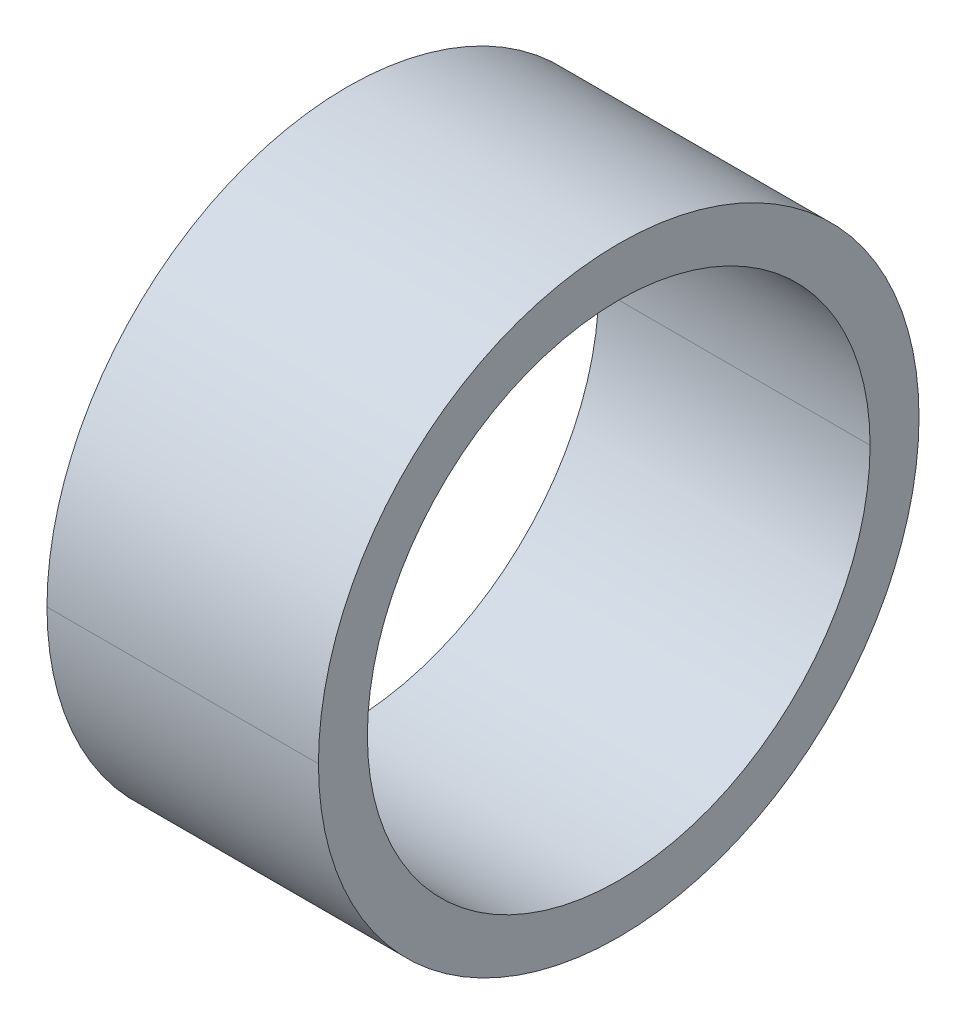
ISO-10303-21;
HEADER;
FILE_DESCRIPTION(('STEP AP214'),'2;1');
FILE_NAME('part.step','',(''),(''),'','','');
FILE_SCHEMA(('AUTOMOTIVE_DESIGN { 1 0 10303 214 1 1 1 1 }'));
ENDSEC;
DATA;
#1=APPLICATION_CONTEXT('core data for automotive mechanical design processes');
#2=APPLICATION_PROTOCOL_DEFINITION('international standard','automotive_design',2000,#1);
#3=PRODUCT_CONTEXT('',#1,'mechanical');
#4=PRODUCT('Part','Part','',(#3));
#5=PRODUCT_RELATED_PRODUCT_CATEGORY('part','',(#4));
#6=PRODUCT_DEFINITION_FORMATION('','',#4);
#7=PRODUCT_DEFINITION_CONTEXT('part definition',#1,'design');
#8=PRODUCT_DEFINITION('design','',#6,#7);
#9=PRODUCT_DEFINITION_SHAPE('','',#8);
#10=(LENGTH_UNIT() NAMED_UNIT(*) SI_UNIT(.MILLI.,.METRE.));
#11=(NAMED_UNIT(*) PLANE_ANGLE_UNIT() SI_UNIT($,.RADIAN.));
#12=(NAMED_UNIT(*) SI_UNIT($,.STERADIAN.) SOLID_ANGLE_UNIT());
#13=UNCERTAINTY_MEASURE_WITH_UNIT(LENGTH_MEASURE(1.E-05),#10,'distance_accuracy_value','');
#14=(GEOMETRIC_REPRESENTATION_CONTEXT(3) GLOBAL_UNCERTAINTY_ASSIGNED_CONTEXT((#13)) GLOBAL_UNIT_ASSIGNED_CONTEXT((#10,
#11,#12)) REPRESENTATION_CONTEXT('',''));
#15=CARTESIAN_POINT('',(0.,0.,0.));
#16=DIRECTION('',(0.,0.,1.));
#17=DIRECTION('',(1.,0.,0.));
#18=AXIS2_PLACEMENT_3D('',#15,#16,#17);
#19=CARTESIAN_POINT('',(-15.8,0.,0.));
#20=DIRECTION('',(1.,0.,0.));
#21=DIRECTION('',(0.,0.,-1.));
#22=AXIS2_PLACEMENT_3D('',#19,#20,#21);
#23=CYLINDRICAL_SURFACE('',#22,15.);
#24=DIRECTION('',(1.,0.,0.));
#25=VECTOR('',#24,1.);
#26=CARTESIAN_POINT('',(-15.8,0.,15.));
#27=LINE('',#26,#25);
#28=CARTESIAN_POINT('',(-15.8,0.,15.));
#29=VERTEX_POINT('',#28);
#30=CARTESIAN_POINT('',(0.399999999999999,0.,15.));
#31=VERTEX_POINT('',#30);
#32=EDGE_CURVE('E110',#29,#31,#27,.T.);
#33=ORIENTED_EDGE('',*,*,#32,.F.);
#34=CARTESIAN_POINT('',(-15.8,0.,0.));
#35=DIRECTION('',(1.,0.,0.));
#36=DIRECTION('',(0.,0.,-1.));
#37=AXIS2_PLACEMENT_3D('',#34,#35,#36);
#38=CIRCLE('',#37,15.);
#39=CARTESIAN_POINT('',(-15.8,0.,-15.));
#40=VERTEX_POINT('',#39);
#41=EDGE_CURVE('E28',#40,#29,#38,.T.);
#42=ORIENTED_EDGE('',*,*,#41,.F.);
#43=DIRECTION('',(1.,0.,0.));
#44=VECTOR('',#43,1.);
#45=CARTESIAN_POINT('',(-15.8,0.,-15.));
#46=LINE('',#45,#44);
#47=CARTESIAN_POINT('',(0.399999999999999,0.,-15.));
#48=VERTEX_POINT('',#47);
#49=EDGE_CURVE('E97',#40,#48,#46,.T.);
#50=ORIENTED_EDGE('',*,*,#49,.T.);
#51=CARTESIAN_POINT('',(0.399999999999999,0.,0.));
#52=DIRECTION('',(1.,0.,0.));
#53=DIRECTION('',(0.,0.,-1.));
#54=AXIS2_PLACEMENT_3D('',#51,#52,#53);
#55=CIRCLE('',#54,15.);
#56=EDGE_CURVE('E11',#48,#31,#55,.T.);
#57=ORIENTED_EDGE('',*,*,#56,.T.);
#58=EDGE_LOOP('',(#33,#42,#50,#57));
#59=FACE_BOUND('',#58,.T.);
#60=ADVANCED_FACE('F17',(#59),#23,.F.);
#61=CARTESIAN_POINT('',(0.399999999999999,0.,0.));
#62=DIRECTION('',(1.,0.,0.));
#63=DIRECTION('',(0.,1.,0.));
#64=AXIS2_PLACEMENT_3D('',#61,#62,#63);
#65=PLANE('',#64);
#66=ORIENTED_EDGE('',*,*,#56,.F.);
#67=CARTESIAN_POINT('',(0.399999999999999,0.,0.));
#68=DIRECTION('',(1.,0.,0.));
#69=DIRECTION('',(0.,0.,-1.));
#70=AXIS2_PLACEMENT_3D('',#67,#68,#69);
#71=CIRCLE('',#70,15.);
#72=EDGE_CURVE('E103',#31,#48,#71,.T.);
#73=ORIENTED_EDGE('',*,*,#72,.F.);
#74=EDGE_LOOP('',(#66,#73));
#75=FACE_BOUND('',#74,.T.);
#76=CARTESIAN_POINT('',(0.399999999999999,0.,0.));
#77=DIRECTION('',(1.,0.,0.));
#78=DIRECTION('',(0.,0.,-1.));
#79=AXIS2_PLACEMENT_3D('',#76,#77,#78);
#80=CIRCLE('',#79,17.92);
#81=CARTESIAN_POINT('',(0.399999999999999,0.,-17.92));
#82=VERTEX_POINT('',#81);
#83=CARTESIAN_POINT('',(0.399999999999999,0.,17.92));
#84=VERTEX_POINT('',#83);
#85=EDGE_CURVE('E93',#82,#84,#80,.T.);
#86=ORIENTED_EDGE('',*,*,#85,.T.);
#87=CARTESIAN_POINT('',(0.399999999999999,0.,0.));
#88=DIRECTION('',(1.,0.,0.));
#89=DIRECTION('',(0.,0.,-1.));
#90=AXIS2_PLACEMENT_3D('',#87,#88,#89);
#91=CIRCLE('',#90,17.92);
#92=EDGE_CURVE('E42',#84,#82,#91,.T.);
#93=ORIENTED_EDGE('',*,*,#92,.T.);
#94=EDGE_LOOP('',(#86,#93));
#95=FACE_BOUND('',#94,.T.);
#96=ADVANCED_FACE('F130',(#75,#95),#65,.T.);
#97=CARTESIAN_POINT('',(-15.8,0.,0.));
#98=DIRECTION('',(1.,0.,0.));
#99=DIRECTION('',(0.,1.,0.));
#100=AXIS2_PLACEMENT_3D('',#97,#98,#99);
#101=PLANE('',#100);
#102=ORIENTED_EDGE('',*,*,#41,.T.);
#103=CARTESIAN_POINT('',(-15.8,0.,0.));
#104=DIRECTION('',(1.,0.,0.));
#105=DIRECTION('',(0.,0.,-1.));
#106=AXIS2_PLACEMENT_3D('',#103,#104,#105);
#107=CIRCLE('',#106,15.);
#108=EDGE_CURVE('E120',#29,#40,#107,.T.);
#109=ORIENTED_EDGE('',*,*,#108,.T.);
#110=EDGE_LOOP('',(#102,#109));
#111=FACE_BOUND('',#110,.T.);
#112=CARTESIAN_POINT('',(-15.8,0.,0.));
#113=DIRECTION('',(1.,0.,0.));
#114=DIRECTION('',(0.,0.,-1.));
#115=AXIS2_PLACEMENT_3D('',#112,#113,#114);
#116=CIRCLE('',#115,17.92);
#117=CARTESIAN_POINT('',(-15.8,0.,-17.92));
#118=VERTEX_POINT('',#117);
#119=CARTESIAN_POINT('',(-15.8,0.,17.92));
#120=VERTEX_POINT('',#119);
#121=EDGE_CURVE('E21',#118,#120,#116,.T.);
#122=ORIENTED_EDGE('',*,*,#121,.F.);
#123=CARTESIAN_POINT('',(-15.8,0.,0.));
#124=DIRECTION('',(1.,0.,0.));
#125=DIRECTION('',(0.,0.,-1.));
#126=AXIS2_PLACEMENT_3D('',#123,#124,#125);
#127=CIRCLE('',#126,17.92);
#128=EDGE_CURVE('E79',#120,#118,#127,.T.);
#129=ORIENTED_EDGE('',*,*,#128,.F.);
#130=EDGE_LOOP('',(#122,#129));
#131=FACE_BOUND('',#130,.T.);
#132=ADVANCED_FACE('F81',(#111,#131),#101,.F.);
#133=CARTESIAN_POINT('',(-15.8,0.,0.));
#134=DIRECTION('',(1.,0.,0.));
#135=DIRECTION('',(0.,0.,-1.));
#136=AXIS2_PLACEMENT_3D('',#133,#134,#135);
#137=CYLINDRICAL_SURFACE('',#136,17.92);
#138=DIRECTION('',(1.,0.,0.));
#139=VECTOR('',#138,1.);
#140=CARTESIAN_POINT('',(-15.8,0.,17.92));
#141=LINE('',#140,#139);
#142=EDGE_CURVE('E89',#120,#84,#141,.T.);
#143=ORIENTED_EDGE('',*,*,#142,.F.);
#144=ORIENTED_EDGE('',*,*,#128,.T.);
#145=DIRECTION('',(1.,0.,0.));
#146=VECTOR('',#145,1.);
#147=CARTESIAN_POINT('',(-15.8,0.,-17.92));
#148=LINE('',#147,#146);
#149=EDGE_CURVE('E86',#118,#82,#148,.T.);
#150=ORIENTED_EDGE('',*,*,#149,.T.);
#151=ORIENTED_EDGE('',*,*,#92,.F.);
#152=EDGE_LOOP('',(#143,#144,#150,#151));
#153=FACE_BOUND('',#152,.T.);
#154=ADVANCED_FACE('F19',(#153),#137,.T.);
#155=CARTESIAN_POINT('',(-15.8,0.,0.));
#156=DIRECTION('',(1.,0.,0.));
#157=DIRECTION('',(0.,0.,-1.));
#158=AXIS2_PLACEMENT_3D('',#155,#156,#157);
#159=CYLINDRICAL_SURFACE('',#158,17.92);
#160=ORIENTED_EDGE('',*,*,#121,.T.);
#161=ORIENTED_EDGE('',*,*,#142,.T.);
#162=ORIENTED_EDGE('',*,*,#85,.F.);
#163=ORIENTED_EDGE('',*,*,#149,.F.);
#164=EDGE_LOOP('',(#160,#161,#162,#163));
#165=FACE_BOUND('',#164,.T.);
#166=ADVANCED_FACE('F95',(#165),#159,.T.);
#167=CARTESIAN_POINT('',(-15.8,0.,0.));
#168=DIRECTION('',(1.,0.,0.));
#169=DIRECTION('',(0.,0.,-1.));
#170=AXIS2_PLACEMENT_3D('',#167,#168,#169);
#171=CYLINDRICAL_SURFACE('',#170,15.);
#172=ORIENTED_EDGE('',*,*,#108,.F.);
#173=ORIENTED_EDGE('',*,*,#32,.T.);
#174=ORIENTED_EDGE('',*,*,#72,.T.);
#175=ORIENTED_EDGE('',*,*,#49,.F.);
#176=EDGE_LOOP('',(#172,#173,#174,#175));
#177=FACE_BOUND('',#176,.T.);
#178=ADVANCED_FACE('F127',(#177),#171,.F.);
#179=CLOSED_SHELL('',(#60,#96,#132,#154,#166,#178));
#180=MANIFOLD_SOLID_BREP('B1',#179);
#181=ADVANCED_BREP_SHAPE_REPRESENTATION('',(#18,#180),#14);
#182=SHAPE_DEFINITION_REPRESENTATION(#9,#181);
ENDSEC;
END-ISO-10303-21;
